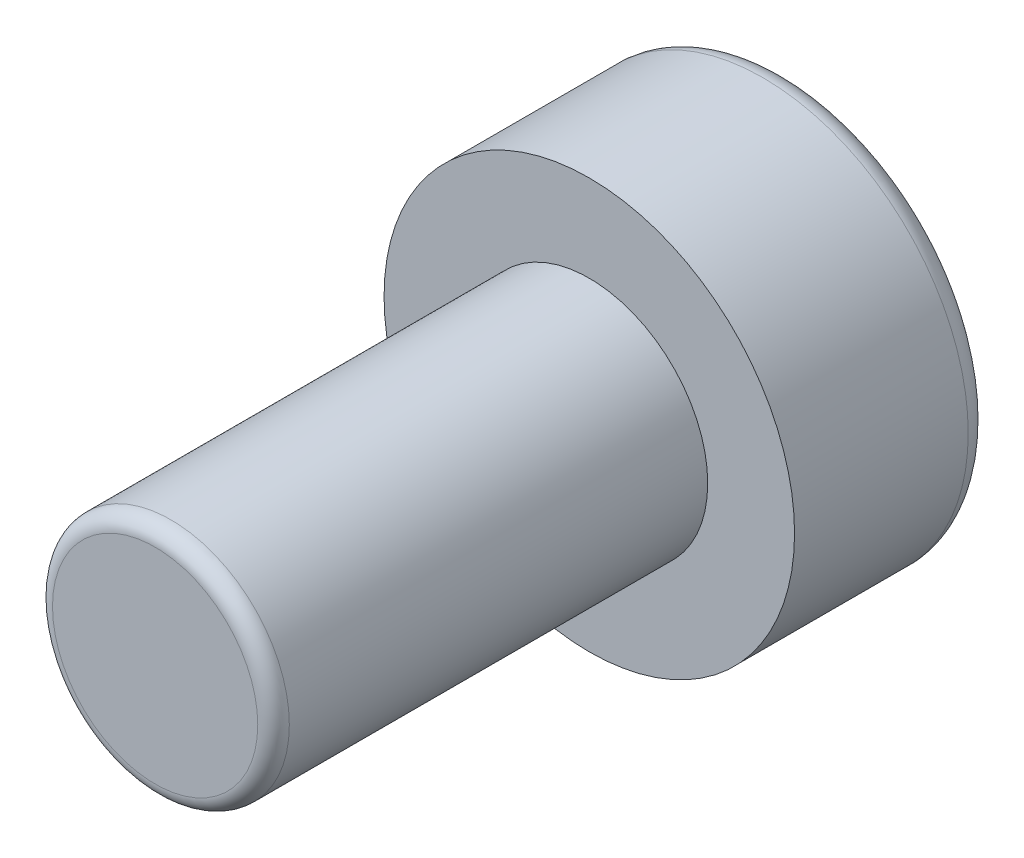
ISO-10303-21;
HEADER;
FILE_DESCRIPTION(('STEP AP214'),'2;1');
FILE_NAME('part.step','',(''),(''),'','','');
FILE_SCHEMA(('AUTOMOTIVE_DESIGN { 1 0 10303 214 1 1 1 1 }'));
ENDSEC;
DATA;
#1=APPLICATION_CONTEXT('core data for automotive mechanical design processes');
#2=APPLICATION_PROTOCOL_DEFINITION('international standard','automotive_design',2000,#1);
#3=PRODUCT_CONTEXT('',#1,'mechanical');
#4=PRODUCT('Part','Part','',(#3));
#5=PRODUCT_RELATED_PRODUCT_CATEGORY('part','',(#4));
#6=PRODUCT_DEFINITION_FORMATION('','',#4);
#7=PRODUCT_DEFINITION_CONTEXT('part definition',#1,'design');
#8=PRODUCT_DEFINITION('design','',#6,#7);
#9=PRODUCT_DEFINITION_SHAPE('','',#8);
#10=(LENGTH_UNIT() NAMED_UNIT(*) SI_UNIT(.MILLI.,.METRE.));
#11=(NAMED_UNIT(*) PLANE_ANGLE_UNIT() SI_UNIT($,.RADIAN.));
#12=(NAMED_UNIT(*) SI_UNIT($,.STERADIAN.) SOLID_ANGLE_UNIT());
#13=UNCERTAINTY_MEASURE_WITH_UNIT(LENGTH_MEASURE(1.E-05),#10,'distance_accuracy_value','');
#14=(GEOMETRIC_REPRESENTATION_CONTEXT(3) GLOBAL_UNCERTAINTY_ASSIGNED_CONTEXT((#13)) GLOBAL_UNIT_ASSIGNED_CONTEXT((#10,
#11,#12)) REPRESENTATION_CONTEXT('',''));
#15=CARTESIAN_POINT('',(0.,0.,0.));
#16=DIRECTION('',(0.,0.,1.));
#17=DIRECTION('',(1.,0.,0.));
#18=AXIS2_PLACEMENT_3D('',#15,#16,#17);
#19=CARTESIAN_POINT('',(0.,0.,2.5));
#20=DIRECTION('',(0.,0.,-1.));
#21=DIRECTION('',(-1.,0.,0.));
#22=AXIS2_PLACEMENT_3D('',#19,#20,#21);
#23=CYLINDRICAL_SURFACE('',#22,2.6);
#24=CARTESIAN_POINT('',(0.,0.,0.3));
#25=DIRECTION('',(0.,0.,1.));
#26=DIRECTION('',(1.,0.,0.));
#27=AXIS2_PLACEMENT_3D('',#24,#25,#26);
#28=CIRCLE('',#27,2.6);
#29=CARTESIAN_POINT('',(2.6,0.,0.3));
#30=VERTEX_POINT('',#29);
#31=EDGE_CURVE('E61',#30,#30,#28,.T.);
#32=ORIENTED_EDGE('',*,*,#31,.T.);
#33=EDGE_LOOP('',(#32));
#34=FACE_BOUND('',#33,.T.);
#35=CARTESIAN_POINT('',(0.,0.,2.5));
#36=DIRECTION('',(0.,0.,1.));
#37=DIRECTION('',(1.,0.,0.));
#38=AXIS2_PLACEMENT_3D('',#35,#36,#37);
#39=CIRCLE('',#38,2.6);
#40=CARTESIAN_POINT('',(2.6,0.,2.5));
#41=VERTEX_POINT('',#40);
#42=EDGE_CURVE('E65',#41,#41,#39,.T.);
#43=ORIENTED_EDGE('',*,*,#42,.F.);
#44=EDGE_LOOP('',(#43));
#45=FACE_BOUND('',#44,.T.);
#46=ADVANCED_FACE('F37',(#34,#45),#23,.T.);
#47=CARTESIAN_POINT('',(0.,0.,2.5));
#48=DIRECTION('',(0.,0.,1.));
#49=DIRECTION('',(1.,0.,0.));
#50=AXIS2_PLACEMENT_3D('',#47,#48,#49);
#51=PLANE('',#50);
#52=CARTESIAN_POINT('',(0.,0.,2.5));
#53=DIRECTION('',(0.,0.,1.));
#54=DIRECTION('',(1.,0.,0.));
#55=AXIS2_PLACEMENT_3D('',#52,#53,#54);
#56=CIRCLE('',#55,1.5);
#57=CARTESIAN_POINT('',(1.5,0.,2.5));
#58=VERTEX_POINT('',#57);
#59=EDGE_CURVE('E50',#58,#58,#56,.T.);
#60=ORIENTED_EDGE('',*,*,#59,.F.);
#61=EDGE_LOOP('',(#60));
#62=FACE_BOUND('',#61,.T.);
#63=ORIENTED_EDGE('',*,*,#42,.T.);
#64=EDGE_LOOP('',(#63));
#65=FACE_BOUND('',#64,.T.);
#66=ADVANCED_FACE('F70',(#62,#65),#51,.T.);
#67=CARTESIAN_POINT('',(0.,0.,0.));
#68=DIRECTION('',(0.,0.,1.));
#69=DIRECTION('',(1.,0.,0.));
#70=AXIS2_PLACEMENT_3D('',#67,#68,#69);
#71=PLANE('',#70);
#72=CARTESIAN_POINT('',(0.,0.,0.));
#73=DIRECTION('',(0.,0.,1.));
#74=DIRECTION('',(1.,0.,0.));
#75=AXIS2_PLACEMENT_3D('',#72,#73,#74);
#76=CIRCLE('',#75,2.3);
#77=CARTESIAN_POINT('',(2.3,0.,0.));
#78=VERTEX_POINT('',#77);
#79=EDGE_CURVE('E55',#78,#78,#76,.F.);
#80=ORIENTED_EDGE('',*,*,#79,.T.);
#81=EDGE_LOOP('',(#80));
#82=FACE_BOUND('',#81,.T.);
#83=ADVANCED_FACE('F78',(#82),#71,.F.);
#84=CARTESIAN_POINT('',(0.,0.,0.3));
#85=DIRECTION('',(0.,0.,1.));
#86=DIRECTION('',(1.,0.,0.));
#87=AXIS2_PLACEMENT_3D('',#84,#85,#86);
#88=TOROIDAL_SURFACE('',#87,2.3,0.3);
#89=ORIENTED_EDGE('',*,*,#79,.F.);
#90=EDGE_LOOP('',(#89));
#91=FACE_BOUND('',#90,.T.);
#92=ORIENTED_EDGE('',*,*,#31,.F.);
#93=EDGE_LOOP('',(#92));
#94=FACE_BOUND('',#93,.T.);
#95=ADVANCED_FACE('F82',(#91,#94),#88,.T.);
#96=CARTESIAN_POINT('',(0.,0.,8.));
#97=DIRECTION('',(0.,0.,-1.));
#98=DIRECTION('',(-1.,0.,0.));
#99=AXIS2_PLACEMENT_3D('',#96,#97,#98);
#100=CYLINDRICAL_SURFACE('',#99,1.5);
#101=CARTESIAN_POINT('',(0.,0.,7.8));
#102=DIRECTION('',(0.,0.,1.));
#103=DIRECTION('',(1.,0.,0.));
#104=AXIS2_PLACEMENT_3D('',#101,#102,#103);
#105=CIRCLE('',#104,1.5);
#106=CARTESIAN_POINT('',(1.5,0.,7.8));
#107=VERTEX_POINT('',#106);
#108=EDGE_CURVE('E10',#107,#107,#105,.F.);
#109=ORIENTED_EDGE('',*,*,#108,.T.);
#110=EDGE_LOOP('',(#109));
#111=FACE_BOUND('',#110,.T.);
#112=ORIENTED_EDGE('',*,*,#59,.T.);
#113=EDGE_LOOP('',(#112));
#114=FACE_BOUND('',#113,.T.);
#115=ADVANCED_FACE('F84',(#111,#114),#100,.T.);
#116=CARTESIAN_POINT('',(0.,0.,8.));
#117=DIRECTION('',(0.,0.,1.));
#118=DIRECTION('',(1.,0.,0.));
#119=AXIS2_PLACEMENT_3D('',#116,#117,#118);
#120=PLANE('',#119);
#121=CARTESIAN_POINT('',(0.,0.,8.));
#122=DIRECTION('',(0.,0.,1.));
#123=DIRECTION('',(1.,0.,0.));
#124=AXIS2_PLACEMENT_3D('',#121,#122,#123);
#125=CIRCLE('',#124,1.3);
#126=CARTESIAN_POINT('',(1.3,0.,8.));
#127=VERTEX_POINT('',#126);
#128=EDGE_CURVE('E45',#127,#127,#125,.T.);
#129=ORIENTED_EDGE('',*,*,#128,.T.);
#130=EDGE_LOOP('',(#129));
#131=FACE_BOUND('',#130,.T.);
#132=ADVANCED_FACE('F90',(#131),#120,.T.);
#133=CARTESIAN_POINT('',(0.,0.,7.8));
#134=DIRECTION('',(0.,0.,1.));
#135=DIRECTION('',(1.,0.,0.));
#136=AXIS2_PLACEMENT_3D('',#133,#134,#135);
#137=TOROIDAL_SURFACE('',#136,1.3,0.2);
#138=ORIENTED_EDGE('',*,*,#108,.F.);
#139=EDGE_LOOP('',(#138));
#140=FACE_BOUND('',#139,.T.);
#141=ORIENTED_EDGE('',*,*,#128,.F.);
#142=EDGE_LOOP('',(#141));
#143=FACE_BOUND('',#142,.T.);
#144=ADVANCED_FACE('F39',(#140,#143),#137,.T.);
#145=CLOSED_SHELL('',(#46,#66,#83,#95,#115,#132,#144));
#146=MANIFOLD_SOLID_BREP('B2',#145);
#147=ADVANCED_BREP_SHAPE_REPRESENTATION('',(#18,#146),#14);
#148=SHAPE_DEFINITION_REPRESENTATION(#9,#147);
ENDSEC;
END-ISO-10303-21;
